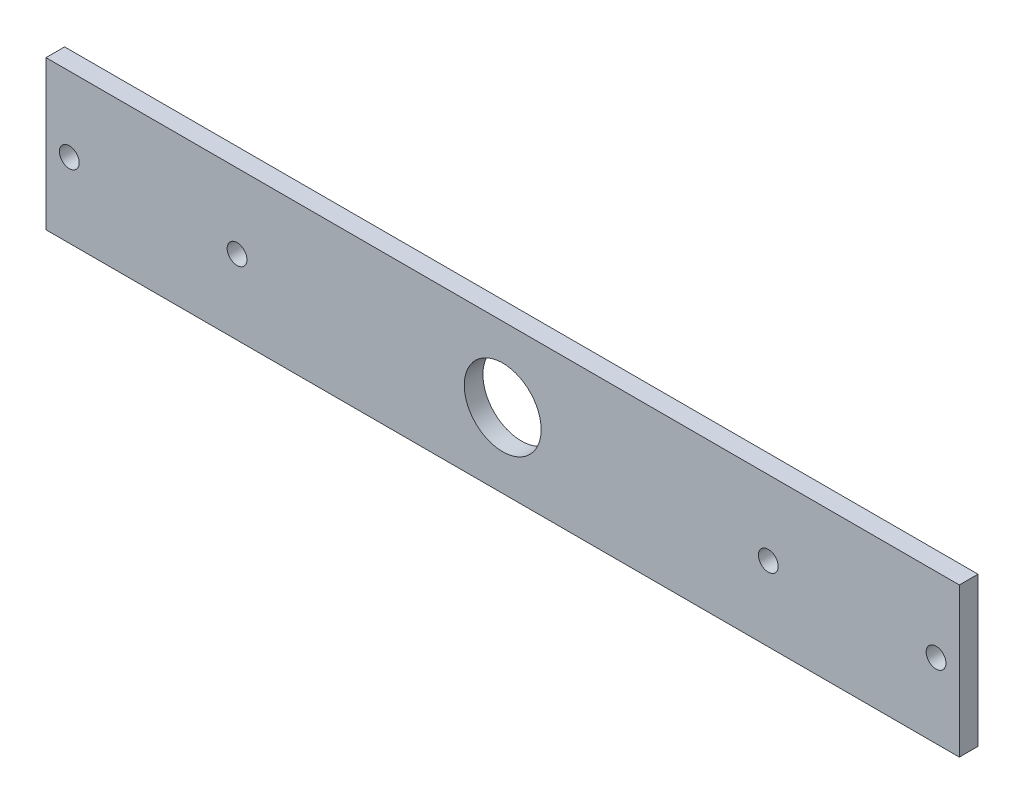
ISO-10303-21;
HEADER;
FILE_DESCRIPTION(('STEP AP214'),'2;1');
FILE_NAME('part.step','',(''),(''),'','','');
FILE_SCHEMA(('AUTOMOTIVE_DESIGN { 1 0 10303 214 1 1 1 1 }'));
ENDSEC;
DATA;
#1=APPLICATION_CONTEXT('core data for automotive mechanical design processes');
#2=APPLICATION_PROTOCOL_DEFINITION('international standard','automotive_design',2000,#1);
#3=PRODUCT_CONTEXT('',#1,'mechanical');
#4=PRODUCT('Part','Part','',(#3));
#5=PRODUCT_RELATED_PRODUCT_CATEGORY('part','',(#4));
#6=PRODUCT_DEFINITION_FORMATION('','',#4);
#7=PRODUCT_DEFINITION_CONTEXT('part definition',#1,'design');
#8=PRODUCT_DEFINITION('design','',#6,#7);
#9=PRODUCT_DEFINITION_SHAPE('','',#8);
#10=(LENGTH_UNIT() NAMED_UNIT(*) SI_UNIT(.MILLI.,.METRE.));
#11=(NAMED_UNIT(*) PLANE_ANGLE_UNIT() SI_UNIT($,.RADIAN.));
#12=(NAMED_UNIT(*) SI_UNIT($,.STERADIAN.) SOLID_ANGLE_UNIT());
#13=UNCERTAINTY_MEASURE_WITH_UNIT(LENGTH_MEASURE(1.E-05),#10,'distance_accuracy_value','');
#14=(GEOMETRIC_REPRESENTATION_CONTEXT(3) GLOBAL_UNCERTAINTY_ASSIGNED_CONTEXT((#13)) GLOBAL_UNIT_ASSIGNED_CONTEXT((#10,
#11,#12)) REPRESENTATION_CONTEXT('',''));
#15=CARTESIAN_POINT('',(0.,0.,0.));
#16=DIRECTION('',(0.,0.,1.));
#17=DIRECTION('',(1.,0.,0.));
#18=AXIS2_PLACEMENT_3D('',#15,#16,#17);
#19=CARTESIAN_POINT('',(0.,0.,0.));
#20=DIRECTION('',(0.,0.,-1.));
#21=DIRECTION('',(-1.,0.,0.));
#22=AXIS2_PLACEMENT_3D('',#19,#20,#21);
#23=PLANE('',#22);
#24=CARTESIAN_POINT('',(147.6375,0.,0.));
#25=DIRECTION('',(0.,0.,1.));
#26=DIRECTION('',(1.,0.,0.));
#27=AXIS2_PLACEMENT_3D('',#24,#25,#26);
#28=CIRCLE('',#27,3.3782);
#29=CARTESIAN_POINT('',(151.0157,0.,0.));
#30=VERTEX_POINT('',#29);
#31=EDGE_CURVE('E136',#30,#30,#28,.T.);
#32=ORIENTED_EDGE('',*,*,#31,.T.);
#33=EDGE_LOOP('',(#32));
#34=FACE_BOUND('',#33,.T.);
#35=DIRECTION('',(0.,1.,0.));
#36=VECTOR('',#35,1.);
#37=CARTESIAN_POINT('',(155.575,-25.4,0.));
#38=LINE('',#37,#36);
#39=CARTESIAN_POINT('',(155.575,-25.4,0.));
#40=VERTEX_POINT('',#39);
#41=CARTESIAN_POINT('',(155.575,25.4,0.));
#42=VERTEX_POINT('',#41);
#43=EDGE_CURVE('E99',#40,#42,#38,.T.);
#44=ORIENTED_EDGE('',*,*,#43,.F.);
#45=DIRECTION('',(1.,0.,0.));
#46=VECTOR('',#45,1.);
#47=CARTESIAN_POINT('',(-155.575,-25.4,0.));
#48=LINE('',#47,#46);
#49=CARTESIAN_POINT('',(-155.575,-25.4,0.));
#50=VERTEX_POINT('',#49);
#51=EDGE_CURVE('E75',#50,#40,#48,.T.);
#52=ORIENTED_EDGE('',*,*,#51,.F.);
#53=DIRECTION('',(0.,-1.,0.));
#54=VECTOR('',#53,1.);
#55=CARTESIAN_POINT('',(-155.575,-25.4,0.));
#56=LINE('',#55,#54);
#57=CARTESIAN_POINT('',(-155.575,25.4,0.));
#58=VERTEX_POINT('',#57);
#59=EDGE_CURVE('E69',#58,#50,#56,.T.);
#60=ORIENTED_EDGE('',*,*,#59,.F.);
#61=DIRECTION('',(-1.,0.,0.));
#62=VECTOR('',#61,1.);
#63=CARTESIAN_POINT('',(-155.575,25.4,0.));
#64=LINE('',#63,#62);
#65=EDGE_CURVE('E91',#42,#58,#64,.T.);
#66=ORIENTED_EDGE('',*,*,#65,.F.);
#67=EDGE_LOOP('',(#44,#52,#60,#66));
#68=FACE_BOUND('',#67,.T.);
#69=CARTESIAN_POINT('',(0.,0.,0.));
#70=DIRECTION('',(0.,0.,1.));
#71=DIRECTION('',(1.,0.,0.));
#72=AXIS2_PLACEMENT_3D('',#69,#70,#71);
#73=CIRCLE('',#72,13.09624);
#74=CARTESIAN_POINT('',(13.09624,0.,0.));
#75=VERTEX_POINT('',#74);
#76=EDGE_CURVE('E102',#75,#75,#73,.T.);
#77=ORIENTED_EDGE('',*,*,#76,.T.);
#78=EDGE_LOOP('',(#77));
#79=FACE_BOUND('',#78,.T.);
#80=CARTESIAN_POINT('',(-90.4875,0.,0.));
#81=DIRECTION('',(0.,0.,1.));
#82=DIRECTION('',(1.,0.,0.));
#83=AXIS2_PLACEMENT_3D('',#80,#81,#82);
#84=CIRCLE('',#83,3.3782);
#85=CARTESIAN_POINT('',(-87.1093,0.,0.));
#86=VERTEX_POINT('',#85);
#87=EDGE_CURVE('E118',#86,#86,#84,.T.);
#88=ORIENTED_EDGE('',*,*,#87,.T.);
#89=EDGE_LOOP('',(#88));
#90=FACE_BOUND('',#89,.T.);
#91=CARTESIAN_POINT('',(-147.6375,0.,0.));
#92=DIRECTION('',(0.,0.,1.));
#93=DIRECTION('',(1.,0.,0.));
#94=AXIS2_PLACEMENT_3D('',#91,#92,#93);
#95=CIRCLE('',#94,3.3782);
#96=CARTESIAN_POINT('',(-144.2593,0.,0.));
#97=VERTEX_POINT('',#96);
#98=EDGE_CURVE('E124',#97,#97,#95,.T.);
#99=ORIENTED_EDGE('',*,*,#98,.T.);
#100=EDGE_LOOP('',(#99));
#101=FACE_BOUND('',#100,.T.);
#102=CARTESIAN_POINT('',(90.4875,0.,0.));
#103=DIRECTION('',(0.,0.,1.));
#104=DIRECTION('',(1.,0.,0.));
#105=AXIS2_PLACEMENT_3D('',#102,#103,#104);
#106=CIRCLE('',#105,3.3782);
#107=CARTESIAN_POINT('',(93.8657,0.,0.));
#108=VERTEX_POINT('',#107);
#109=EDGE_CURVE('E130',#108,#108,#106,.T.);
#110=ORIENTED_EDGE('',*,*,#109,.T.);
#111=EDGE_LOOP('',(#110));
#112=FACE_BOUND('',#111,.T.);
#113=ADVANCED_FACE('F35',(#34,#68,#79,#90,#101,#112),#23,.T.);
#114=CARTESIAN_POINT('',(155.575,-25.4,6.35));
#115=DIRECTION('',(-1.,0.,0.));
#116=DIRECTION('',(0.,0.,1.));
#117=AXIS2_PLACEMENT_3D('',#114,#115,#116);
#118=PLANE('',#117);
#119=ORIENTED_EDGE('',*,*,#43,.T.);
#120=DIRECTION('',(0.,0.,-1.));
#121=VECTOR('',#120,1.);
#122=CARTESIAN_POINT('',(155.575,25.4,6.35));
#123=LINE('',#122,#121);
#124=CARTESIAN_POINT('',(155.575,25.4,6.35));
#125=VERTEX_POINT('',#124);
#126=EDGE_CURVE('E11',#125,#42,#123,.T.);
#127=ORIENTED_EDGE('',*,*,#126,.F.);
#128=DIRECTION('',(0.,1.,0.));
#129=VECTOR('',#128,1.);
#130=CARTESIAN_POINT('',(155.575,-25.4,6.35));
#131=LINE('',#130,#129);
#132=CARTESIAN_POINT('',(155.575,-25.4,6.35));
#133=VERTEX_POINT('',#132);
#134=EDGE_CURVE('E87',#133,#125,#131,.T.);
#135=ORIENTED_EDGE('',*,*,#134,.F.);
#136=DIRECTION('',(0.,0.,-1.));
#137=VECTOR('',#136,1.);
#138=CARTESIAN_POINT('',(155.575,-25.4,6.35));
#139=LINE('',#138,#137);
#140=EDGE_CURVE('E95',#133,#40,#139,.T.);
#141=ORIENTED_EDGE('',*,*,#140,.T.);
#142=EDGE_LOOP('',(#119,#127,#135,#141));
#143=FACE_BOUND('',#142,.T.);
#144=ADVANCED_FACE('F37',(#143),#118,.F.);
#145=CARTESIAN_POINT('',(-155.575,25.4,6.35));
#146=DIRECTION('',(0.,-1.,0.));
#147=DIRECTION('',(0.,0.,-1.));
#148=AXIS2_PLACEMENT_3D('',#145,#146,#147);
#149=PLANE('',#148);
#150=ORIENTED_EDGE('',*,*,#65,.T.);
#151=DIRECTION('',(0.,0.,-1.));
#152=VECTOR('',#151,1.);
#153=CARTESIAN_POINT('',(-155.575,25.4,6.35));
#154=LINE('',#153,#152);
#155=CARTESIAN_POINT('',(-155.575,25.4,6.35));
#156=VERTEX_POINT('',#155);
#157=EDGE_CURVE('E44',#156,#58,#154,.T.);
#158=ORIENTED_EDGE('',*,*,#157,.F.);
#159=DIRECTION('',(-1.,0.,0.));
#160=VECTOR('',#159,1.);
#161=CARTESIAN_POINT('',(-155.575,25.4,6.35));
#162=LINE('',#161,#160);
#163=EDGE_CURVE('E82',#125,#156,#162,.T.);
#164=ORIENTED_EDGE('',*,*,#163,.F.);
#165=ORIENTED_EDGE('',*,*,#126,.T.);
#166=EDGE_LOOP('',(#150,#158,#164,#165));
#167=FACE_BOUND('',#166,.T.);
#168=ADVANCED_FACE('F90',(#167),#149,.F.);
#169=CARTESIAN_POINT('',(-155.575,-25.4,6.35));
#170=DIRECTION('',(1.,0.,0.));
#171=DIRECTION('',(0.,0.,-1.));
#172=AXIS2_PLACEMENT_3D('',#169,#170,#171);
#173=PLANE('',#172);
#174=ORIENTED_EDGE('',*,*,#59,.T.);
#175=DIRECTION('',(0.,0.,-1.));
#176=VECTOR('',#175,1.);
#177=CARTESIAN_POINT('',(-155.575,-25.4,6.35));
#178=LINE('',#177,#176);
#179=CARTESIAN_POINT('',(-155.575,-25.4,6.35));
#180=VERTEX_POINT('',#179);
#181=EDGE_CURVE('E92',#180,#50,#178,.T.);
#182=ORIENTED_EDGE('',*,*,#181,.F.);
#183=DIRECTION('',(0.,-1.,0.));
#184=VECTOR('',#183,1.);
#185=CARTESIAN_POINT('',(-155.575,-25.4,6.35));
#186=LINE('',#185,#184);
#187=EDGE_CURVE('E85',#156,#180,#186,.T.);
#188=ORIENTED_EDGE('',*,*,#187,.F.);
#189=ORIENTED_EDGE('',*,*,#157,.T.);
#190=EDGE_LOOP('',(#174,#182,#188,#189));
#191=FACE_BOUND('',#190,.T.);
#192=ADVANCED_FACE('F93',(#191),#173,.F.);
#193=CARTESIAN_POINT('',(-155.575,-25.4,6.35));
#194=DIRECTION('',(0.,1.,0.));
#195=DIRECTION('',(0.,0.,1.));
#196=AXIS2_PLACEMENT_3D('',#193,#194,#195);
#197=PLANE('',#196);
#198=ORIENTED_EDGE('',*,*,#51,.T.);
#199=ORIENTED_EDGE('',*,*,#140,.F.);
#200=DIRECTION('',(1.,0.,0.));
#201=VECTOR('',#200,1.);
#202=CARTESIAN_POINT('',(-155.575,-25.4,6.35));
#203=LINE('',#202,#201);
#204=EDGE_CURVE('E52',#180,#133,#203,.T.);
#205=ORIENTED_EDGE('',*,*,#204,.F.);
#206=ORIENTED_EDGE('',*,*,#181,.T.);
#207=EDGE_LOOP('',(#198,#199,#205,#206));
#208=FACE_BOUND('',#207,.T.);
#209=ADVANCED_FACE('F107',(#208),#197,.F.);
#210=CARTESIAN_POINT('',(0.,0.,6.35));
#211=DIRECTION('',(0.,0.,-1.));
#212=DIRECTION('',(-1.,0.,0.));
#213=AXIS2_PLACEMENT_3D('',#210,#211,#212);
#214=PLANE('',#213);
#215=CARTESIAN_POINT('',(147.6375,0.,6.35));
#216=DIRECTION('',(0.,0.,1.));
#217=DIRECTION('',(1.,0.,0.));
#218=AXIS2_PLACEMENT_3D('',#215,#216,#217);
#219=CIRCLE('',#218,3.3782);
#220=CARTESIAN_POINT('',(151.0157,0.,6.35));
#221=VERTEX_POINT('',#220);
#222=EDGE_CURVE('E139',#221,#221,#219,.T.);
#223=ORIENTED_EDGE('',*,*,#222,.F.);
#224=EDGE_LOOP('',(#223));
#225=FACE_BOUND('',#224,.T.);
#226=CARTESIAN_POINT('',(90.4875,0.,6.35));
#227=DIRECTION('',(0.,0.,1.));
#228=DIRECTION('',(1.,0.,0.));
#229=AXIS2_PLACEMENT_3D('',#226,#227,#228);
#230=CIRCLE('',#229,3.3782);
#231=CARTESIAN_POINT('',(93.8657,0.,6.35));
#232=VERTEX_POINT('',#231);
#233=EDGE_CURVE('E133',#232,#232,#230,.T.);
#234=ORIENTED_EDGE('',*,*,#233,.F.);
#235=EDGE_LOOP('',(#234));
#236=FACE_BOUND('',#235,.T.);
#237=CARTESIAN_POINT('',(-147.6375,0.,6.35));
#238=DIRECTION('',(0.,0.,1.));
#239=DIRECTION('',(1.,0.,0.));
#240=AXIS2_PLACEMENT_3D('',#237,#238,#239);
#241=CIRCLE('',#240,3.3782);
#242=CARTESIAN_POINT('',(-144.2593,0.,6.35));
#243=VERTEX_POINT('',#242);
#244=EDGE_CURVE('E127',#243,#243,#241,.T.);
#245=ORIENTED_EDGE('',*,*,#244,.F.);
#246=EDGE_LOOP('',(#245));
#247=FACE_BOUND('',#246,.T.);
#248=CARTESIAN_POINT('',(-90.4875,0.,6.35));
#249=DIRECTION('',(0.,0.,1.));
#250=DIRECTION('',(1.,0.,0.));
#251=AXIS2_PLACEMENT_3D('',#248,#249,#250);
#252=CIRCLE('',#251,3.3782);
#253=CARTESIAN_POINT('',(-87.1093,0.,6.35));
#254=VERTEX_POINT('',#253);
#255=EDGE_CURVE('E121',#254,#254,#252,.T.);
#256=ORIENTED_EDGE('',*,*,#255,.F.);
#257=EDGE_LOOP('',(#256));
#258=FACE_BOUND('',#257,.T.);
#259=CARTESIAN_POINT('',(0.,0.,6.35));
#260=DIRECTION('',(0.,0.,1.));
#261=DIRECTION('',(1.,0.,0.));
#262=AXIS2_PLACEMENT_3D('',#259,#260,#261);
#263=CIRCLE('',#262,13.09624);
#264=CARTESIAN_POINT('',(13.09624,0.,6.35));
#265=VERTEX_POINT('',#264);
#266=EDGE_CURVE('E115',#265,#265,#263,.T.);
#267=ORIENTED_EDGE('',*,*,#266,.F.);
#268=EDGE_LOOP('',(#267));
#269=FACE_BOUND('',#268,.T.);
#270=ORIENTED_EDGE('',*,*,#134,.T.);
#271=ORIENTED_EDGE('',*,*,#163,.T.);
#272=ORIENTED_EDGE('',*,*,#187,.T.);
#273=ORIENTED_EDGE('',*,*,#204,.T.);
#274=EDGE_LOOP('',(#270,#271,#272,#273));
#275=FACE_BOUND('',#274,.T.);
#276=ADVANCED_FACE('F83',(#225,#236,#247,#258,#269,#275),#214,.F.);
#277=CARTESIAN_POINT('',(0.,0.,6.35));
#278=DIRECTION('',(0.,0.,1.));
#279=DIRECTION('',(1.,0.,0.));
#280=AXIS2_PLACEMENT_3D('',#277,#278,#279);
#281=CYLINDRICAL_SURFACE('',#280,13.09624);
#282=ORIENTED_EDGE('',*,*,#76,.F.);
#283=EDGE_LOOP('',(#282));
#284=FACE_BOUND('',#283,.T.);
#285=ORIENTED_EDGE('',*,*,#266,.T.);
#286=EDGE_LOOP('',(#285));
#287=FACE_BOUND('',#286,.T.);
#288=ADVANCED_FACE('F147',(#284,#287),#281,.F.);
#289=CARTESIAN_POINT('',(-90.4875,0.,6.35));
#290=DIRECTION('',(0.,0.,1.));
#291=DIRECTION('',(1.,0.,0.));
#292=AXIS2_PLACEMENT_3D('',#289,#290,#291);
#293=CYLINDRICAL_SURFACE('',#292,3.3782);
#294=ORIENTED_EDGE('',*,*,#87,.F.);
#295=EDGE_LOOP('',(#294));
#296=FACE_BOUND('',#295,.T.);
#297=ORIENTED_EDGE('',*,*,#255,.T.);
#298=EDGE_LOOP('',(#297));
#299=FACE_BOUND('',#298,.T.);
#300=ADVANCED_FACE('F158',(#296,#299),#293,.F.);
#301=CARTESIAN_POINT('',(-147.6375,0.,6.35));
#302=DIRECTION('',(0.,0.,1.));
#303=DIRECTION('',(1.,0.,0.));
#304=AXIS2_PLACEMENT_3D('',#301,#302,#303);
#305=CYLINDRICAL_SURFACE('',#304,3.3782);
#306=ORIENTED_EDGE('',*,*,#98,.F.);
#307=EDGE_LOOP('',(#306));
#308=FACE_BOUND('',#307,.T.);
#309=ORIENTED_EDGE('',*,*,#244,.T.);
#310=EDGE_LOOP('',(#309));
#311=FACE_BOUND('',#310,.T.);
#312=ADVANCED_FACE('F164',(#308,#311),#305,.F.);
#313=CARTESIAN_POINT('',(90.4875,0.,6.35));
#314=DIRECTION('',(0.,0.,1.));
#315=DIRECTION('',(1.,0.,0.));
#316=AXIS2_PLACEMENT_3D('',#313,#314,#315);
#317=CYLINDRICAL_SURFACE('',#316,3.3782);
#318=ORIENTED_EDGE('',*,*,#109,.F.);
#319=EDGE_LOOP('',(#318));
#320=FACE_BOUND('',#319,.T.);
#321=ORIENTED_EDGE('',*,*,#233,.T.);
#322=EDGE_LOOP('',(#321));
#323=FACE_BOUND('',#322,.T.);
#324=ADVANCED_FACE('F204',(#320,#323),#317,.F.);
#325=CARTESIAN_POINT('',(147.6375,0.,6.35));
#326=DIRECTION('',(0.,0.,1.));
#327=DIRECTION('',(1.,0.,0.));
#328=AXIS2_PLACEMENT_3D('',#325,#326,#327);
#329=CYLINDRICAL_SURFACE('',#328,3.3782);
#330=ORIENTED_EDGE('',*,*,#31,.F.);
#331=EDGE_LOOP('',(#330));
#332=FACE_BOUND('',#331,.T.);
#333=ORIENTED_EDGE('',*,*,#222,.T.);
#334=EDGE_LOOP('',(#333));
#335=FACE_BOUND('',#334,.T.);
#336=ADVANCED_FACE('F143',(#332,#335),#329,.F.);
#337=CLOSED_SHELL('',(#113,#144,#168,#192,#209,#276,#288,#300,#312,#324,#336));
#338=MANIFOLD_SOLID_BREP('B2',#337);
#339=ADVANCED_BREP_SHAPE_REPRESENTATION('',(#18,#338),#14);
#340=SHAPE_DEFINITION_REPRESENTATION(#9,#339);
ENDSEC;
END-ISO-10303-21;
